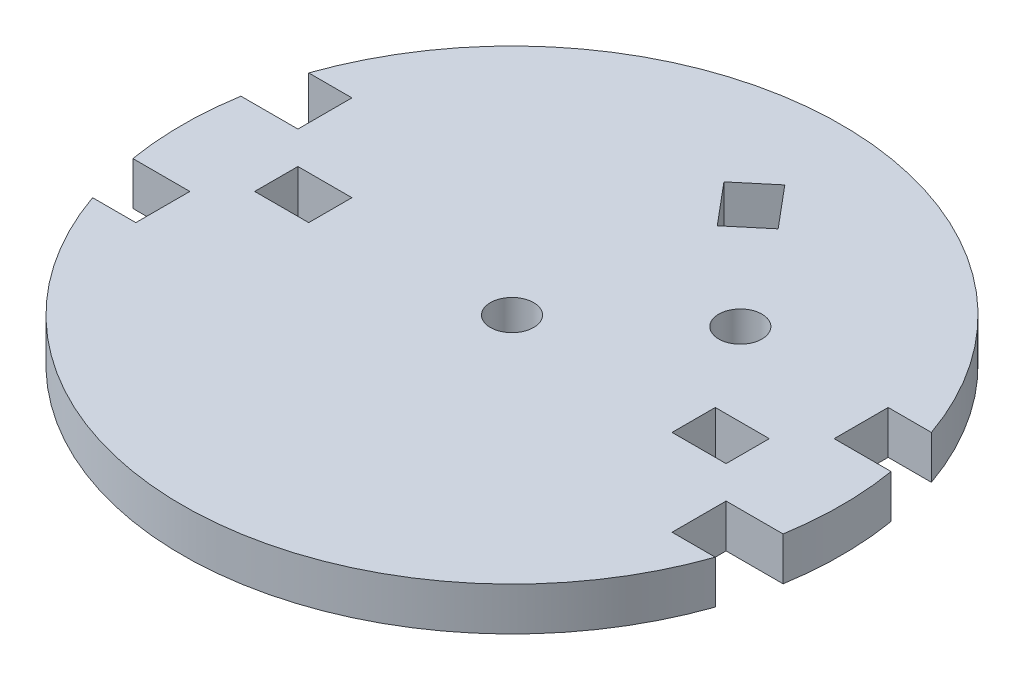
ISO-10303-21;
HEADER;
FILE_DESCRIPTION(('STEP AP214'),'2;1');
FILE_NAME('part.step','',(''),(''),'','','');
FILE_SCHEMA(('AUTOMOTIVE_DESIGN { 1 0 10303 214 1 1 1 1 }'));
ENDSEC;
DATA;
#1=APPLICATION_CONTEXT('core data for automotive mechanical design processes');
#2=APPLICATION_PROTOCOL_DEFINITION('international standard','automotive_design',2000,#1);
#3=PRODUCT_CONTEXT('',#1,'mechanical');
#4=PRODUCT('Part','Part','',(#3));
#5=PRODUCT_RELATED_PRODUCT_CATEGORY('part','',(#4));
#6=PRODUCT_DEFINITION_FORMATION('','',#4);
#7=PRODUCT_DEFINITION_CONTEXT('part definition',#1,'design');
#8=PRODUCT_DEFINITION('design','',#6,#7);
#9=PRODUCT_DEFINITION_SHAPE('','',#8);
#10=(LENGTH_UNIT() NAMED_UNIT(*) SI_UNIT(.MILLI.,.METRE.));
#11=(NAMED_UNIT(*) PLANE_ANGLE_UNIT() SI_UNIT($,.RADIAN.));
#12=(NAMED_UNIT(*) SI_UNIT($,.STERADIAN.) SOLID_ANGLE_UNIT());
#13=UNCERTAINTY_MEASURE_WITH_UNIT(LENGTH_MEASURE(1.E-05),#10,'distance_accuracy_value','');
#14=(GEOMETRIC_REPRESENTATION_CONTEXT(3) GLOBAL_UNCERTAINTY_ASSIGNED_CONTEXT((#13)) GLOBAL_UNIT_ASSIGNED_CONTEXT((#10,
#11,#12)) REPRESENTATION_CONTEXT('',''));
#15=CARTESIAN_POINT('',(0.,0.,0.));
#16=DIRECTION('',(0.,0.,1.));
#17=DIRECTION('',(1.,0.,0.));
#18=AXIS2_PLACEMENT_3D('',#15,#16,#17);
#19=CARTESIAN_POINT('',(0.,4.,0.));
#20=DIRECTION('',(0.,1.,0.));
#21=DIRECTION('',(0.,0.,1.));
#22=AXIS2_PLACEMENT_3D('',#19,#20,#21);
#23=PLANE('',#22);
#24=DIRECTION('',(0.,0.,1.));
#25=VECTOR('',#24,1.);
#26=CARTESIAN_POINT('',(24.8140590684478,4.,0.));
#27=LINE('',#26,#25);
#28=CARTESIAN_POINT('',(24.8140590684478,4.,5.));
#29=VERTEX_POINT('',#28);
#30=CARTESIAN_POINT('',(24.8140590684478,4.,10.));
#31=VERTEX_POINT('',#30);
#32=EDGE_CURVE('E319',#29,#31,#27,.T.);
#33=ORIENTED_EDGE('',*,*,#32,.F.);
#34=DIRECTION('',(1.,0.,0.));
#35=VECTOR('',#34,1.);
#36=CARTESIAN_POINT('',(0.,4.,5.));
#37=LINE('',#36,#35);
#38=CARTESIAN_POINT('',(30.0873727666608,4.,5.));
#39=VERTEX_POINT('',#38);
#40=EDGE_CURVE('E330',#29,#39,#37,.T.);
#41=ORIENTED_EDGE('',*,*,#40,.T.);
#42=CARTESIAN_POINT('',(0.,4.,0.));
#43=DIRECTION('',(0.,1.,0.));
#44=DIRECTION('',(0.,0.,1.));
#45=AXIS2_PLACEMENT_3D('',#42,#43,#44);
#46=CIRCLE('',#45,30.5);
#47=CARTESIAN_POINT('',(30.0873727666608,4.,-5.));
#48=VERTEX_POINT('',#47);
#49=EDGE_CURVE('E42',#39,#48,#46,.T.);
#50=ORIENTED_EDGE('',*,*,#49,.T.);
#51=DIRECTION('',(1.,0.,0.));
#52=VECTOR('',#51,1.);
#53=CARTESIAN_POINT('',(0.,4.,-5.00000000000001));
#54=LINE('',#53,#52);
#55=CARTESIAN_POINT('',(24.8140590684478,4.,-5.));
#56=VERTEX_POINT('',#55);
#57=EDGE_CURVE('E354',#56,#48,#54,.T.);
#58=ORIENTED_EDGE('',*,*,#57,.F.);
#59=DIRECTION('',(0.,0.,-1.));
#60=VECTOR('',#59,1.);
#61=CARTESIAN_POINT('',(24.8140590684478,4.,0.));
#62=LINE('',#61,#60);
#63=CARTESIAN_POINT('',(24.8140590684478,4.,-10.));
#64=VERTEX_POINT('',#63);
#65=EDGE_CURVE('E362',#56,#64,#62,.T.);
#66=ORIENTED_EDGE('',*,*,#65,.T.);
#67=DIRECTION('',(1.,0.,0.));
#68=VECTOR('',#67,1.);
#69=CARTESIAN_POINT('',(0.,4.,-10.));
#70=LINE('',#69,#68);
#71=CARTESIAN_POINT('',(28.8140590684478,4.,-10.));
#72=VERTEX_POINT('',#71);
#73=EDGE_CURVE('E344',#64,#72,#70,.T.);
#74=ORIENTED_EDGE('',*,*,#73,.T.);
#75=CARTESIAN_POINT('',(-28.8140590684478,4.,-10.));
#76=VERTEX_POINT('',#75);
#77=EDGE_CURVE('E587',#72,#76,#46,.T.);
#78=ORIENTED_EDGE('',*,*,#77,.T.);
#79=DIRECTION('',(-1.,0.,0.));
#80=VECTOR('',#79,1.);
#81=CARTESIAN_POINT('',(0.,4.,-10.));
#82=LINE('',#81,#80);
#83=CARTESIAN_POINT('',(-24.8140590684478,4.,-10.));
#84=VERTEX_POINT('',#83);
#85=EDGE_CURVE('E379',#84,#76,#82,.T.);
#86=ORIENTED_EDGE('',*,*,#85,.F.);
#87=DIRECTION('',(0.,0.,-1.));
#88=VECTOR('',#87,1.);
#89=CARTESIAN_POINT('',(-24.8140590684478,4.,0.));
#90=LINE('',#89,#88);
#91=CARTESIAN_POINT('',(-24.8140590684478,4.,-5.));
#92=VERTEX_POINT('',#91);
#93=EDGE_CURVE('E388',#92,#84,#90,.T.);
#94=ORIENTED_EDGE('',*,*,#93,.F.);
#95=DIRECTION('',(-1.,0.,0.));
#96=VECTOR('',#95,1.);
#97=CARTESIAN_POINT('',(0.,4.,-5.));
#98=LINE('',#97,#96);
#99=CARTESIAN_POINT('',(-30.0873727666608,4.,-5.));
#100=VERTEX_POINT('',#99);
#101=EDGE_CURVE('E369',#92,#100,#98,.T.);
#102=ORIENTED_EDGE('',*,*,#101,.T.);
#103=CARTESIAN_POINT('',(-30.0873727666608,4.,5.));
#104=VERTEX_POINT('',#103);
#105=EDGE_CURVE('E43',#100,#104,#46,.T.);
#106=ORIENTED_EDGE('',*,*,#105,.T.);
#107=DIRECTION('',(-1.,0.,0.));
#108=VECTOR('',#107,1.);
#109=CARTESIAN_POINT('',(0.,4.,5.00000000000001));
#110=LINE('',#109,#108);
#111=CARTESIAN_POINT('',(-24.8140590684478,4.,5.));
#112=VERTEX_POINT('',#111);
#113=EDGE_CURVE('E395',#112,#104,#110,.T.);
#114=ORIENTED_EDGE('',*,*,#113,.F.);
#115=DIRECTION('',(0.,0.,1.));
#116=VECTOR('',#115,1.);
#117=CARTESIAN_POINT('',(-24.8140590684478,4.,0.));
#118=LINE('',#117,#116);
#119=CARTESIAN_POINT('',(-24.8140590684478,4.,10.));
#120=VERTEX_POINT('',#119);
#121=EDGE_CURVE('E406',#112,#120,#118,.T.);
#122=ORIENTED_EDGE('',*,*,#121,.T.);
#123=DIRECTION('',(-1.,0.,0.));
#124=VECTOR('',#123,1.);
#125=CARTESIAN_POINT('',(0.,4.,10.));
#126=LINE('',#125,#124);
#127=CARTESIAN_POINT('',(-28.8140590684478,4.,10.));
#128=VERTEX_POINT('',#127);
#129=EDGE_CURVE('E414',#120,#128,#126,.T.);
#130=ORIENTED_EDGE('',*,*,#129,.T.);
#131=CARTESIAN_POINT('',(28.8140590684478,4.,10.));
#132=VERTEX_POINT('',#131);
#133=EDGE_CURVE('E11',#128,#132,#46,.T.);
#134=ORIENTED_EDGE('',*,*,#133,.T.);
#135=DIRECTION('',(1.,0.,0.));
#136=VECTOR('',#135,1.);
#137=CARTESIAN_POINT('',(0.,4.,10.));
#138=LINE('',#137,#136);
#139=EDGE_CURVE('E338',#31,#132,#138,.T.);
#140=ORIENTED_EDGE('',*,*,#139,.F.);
#141=EDGE_LOOP('',(#33,#41,#50,#58,#66,#74,#78,#86,#94,#102,#106,#114,#122,#130,#134,#140));
#142=FACE_BOUND('',#141,.T.);
#143=CARTESIAN_POINT('',(0.,4.,0.));
#144=DIRECTION('',(0.,1.,0.));
#145=DIRECTION('',(0.,0.,1.));
#146=AXIS2_PLACEMENT_3D('',#143,#144,#145);
#147=CIRCLE('',#146,2.);
#148=CARTESIAN_POINT('',(0.,4.,2.));
#149=VERTEX_POINT('',#148);
#150=EDGE_CURVE('E421',#149,#149,#147,.T.);
#151=ORIENTED_EDGE('',*,*,#150,.F.);
#152=EDGE_LOOP('',(#151));
#153=FACE_BOUND('',#152,.T.);
#154=DIRECTION('',(0.,0.,-1.));
#155=VECTOR('',#154,1.);
#156=CARTESIAN_POINT('',(-16.8140590684478,4.,2.));
#157=LINE('',#156,#155);
#158=CARTESIAN_POINT('',(-16.8140590684478,4.,2.));
#159=VERTEX_POINT('',#158);
#160=CARTESIAN_POINT('',(-16.8140590684478,4.,-2.));
#161=VERTEX_POINT('',#160);
#162=EDGE_CURVE('E287',#159,#161,#157,.T.);
#163=ORIENTED_EDGE('',*,*,#162,.F.);
#164=DIRECTION('',(1.,0.,0.));
#165=VECTOR('',#164,1.);
#166=CARTESIAN_POINT('',(-16.8140590684478,4.,2.));
#167=LINE('',#166,#165);
#168=CARTESIAN_POINT('',(-21.8140590684478,4.,2.));
#169=VERTEX_POINT('',#168);
#170=EDGE_CURVE('E298',#169,#159,#167,.T.);
#171=ORIENTED_EDGE('',*,*,#170,.F.);
#172=DIRECTION('',(0.,0.,1.));
#173=VECTOR('',#172,1.);
#174=CARTESIAN_POINT('',(-21.8140590684478,4.,-2.));
#175=LINE('',#174,#173);
#176=CARTESIAN_POINT('',(-21.8140590684478,4.,-2.));
#177=VERTEX_POINT('',#176);
#178=EDGE_CURVE('E312',#177,#169,#175,.T.);
#179=ORIENTED_EDGE('',*,*,#178,.F.);
#180=DIRECTION('',(-1.,0.,0.));
#181=VECTOR('',#180,1.);
#182=CARTESIAN_POINT('',(-16.8140590684478,4.,-2.));
#183=LINE('',#182,#181);
#184=EDGE_CURVE('E309',#161,#177,#183,.T.);
#185=ORIENTED_EDGE('',*,*,#184,.F.);
#186=EDGE_LOOP('',(#163,#171,#179,#185));
#187=FACE_BOUND('',#186,.T.);
#188=DIRECTION('',(0.,0.,1.));
#189=VECTOR('',#188,1.);
#190=CARTESIAN_POINT('',(16.8140590684478,4.,2.));
#191=LINE('',#190,#189);
#192=CARTESIAN_POINT('',(16.8140590684478,4.,-2.));
#193=VERTEX_POINT('',#192);
#194=CARTESIAN_POINT('',(16.8140590684478,4.,2.));
#195=VERTEX_POINT('',#194);
#196=EDGE_CURVE('E259',#193,#195,#191,.T.);
#197=ORIENTED_EDGE('',*,*,#196,.F.);
#198=DIRECTION('',(-1.,0.,0.));
#199=VECTOR('',#198,1.);
#200=CARTESIAN_POINT('',(16.8140590684478,4.,-2.));
#201=LINE('',#200,#199);
#202=CARTESIAN_POINT('',(21.8140590684478,4.,-2.));
#203=VERTEX_POINT('',#202);
#204=EDGE_CURVE('E266',#203,#193,#201,.T.);
#205=ORIENTED_EDGE('',*,*,#204,.F.);
#206=DIRECTION('',(0.,0.,-1.));
#207=VECTOR('',#206,1.);
#208=CARTESIAN_POINT('',(21.8140590684478,4.,-2.));
#209=LINE('',#208,#207);
#210=CARTESIAN_POINT('',(21.8140590684478,4.,2.));
#211=VERTEX_POINT('',#210);
#212=EDGE_CURVE('E280',#211,#203,#209,.T.);
#213=ORIENTED_EDGE('',*,*,#212,.F.);
#214=DIRECTION('',(1.,0.,0.));
#215=VECTOR('',#214,1.);
#216=CARTESIAN_POINT('',(16.8140590684478,4.,2.));
#217=LINE('',#216,#215);
#218=EDGE_CURVE('E277',#195,#211,#217,.T.);
#219=ORIENTED_EDGE('',*,*,#218,.F.);
#220=EDGE_LOOP('',(#197,#205,#213,#219));
#221=FACE_BOUND('',#220,.T.);
#222=CARTESIAN_POINT('',(11.4906666467847,4.,-9.64181414529814));
#223=DIRECTION('',(0.,1.,0.));
#224=DIRECTION('',(0.,0.,1.));
#225=AXIS2_PLACEMENT_3D('',#222,#223,#224);
#226=CIRCLE('',#225,2.);
#227=CARTESIAN_POINT('',(11.4906666467847,4.,-7.64181414529814));
#228=VERTEX_POINT('',#227);
#229=EDGE_CURVE('E252',#228,#228,#226,.T.);
#230=ORIENTED_EDGE('',*,*,#229,.F.);
#231=EDGE_LOOP('',(#230));
#232=FACE_BOUND('',#231,.T.);
#233=DIRECTION('',(0.642787609686539,0.,0.766044443118978));
#234=VECTOR('',#233,1.);
#235=CARTESIAN_POINT('',(12.6397333114632,4.,-10.6059955598279));
#236=LINE('',#235,#234);
#237=CARTESIAN_POINT('',(2.19443465405687,4.,-23.0542177605114));
#238=VERTEX_POINT('',#237);
#239=CARTESIAN_POINT('',(5.40837270248957,4.,-19.2239955449165));
#240=VERTEX_POINT('',#239);
#241=EDGE_CURVE('E246',#238,#240,#236,.T.);
#242=ORIENTED_EDGE('',*,*,#241,.T.);
#243=DIRECTION('',(-0.766044443118978,0.,0.64278760968654));
#244=VECTOR('',#243,1.);
#245=CARTESIAN_POINT('',(-7.23136060897363,4.,-8.61799998508857));
#246=LINE('',#245,#244);
#247=CARTESIAN_POINT('',(2.34419493001365,4.,-16.6528451061704));
#248=VERTEX_POINT('',#247);
#249=EDGE_CURVE('E50',#240,#248,#246,.T.);
#250=ORIENTED_EDGE('',*,*,#249,.T.);
#251=DIRECTION('',(0.64278760968654,0.,0.766044443118978));
#252=VECTOR('',#251,1.);
#253=CARTESIAN_POINT('',(9.57555553898728,4.,-8.03484512108179));
#254=LINE('',#253,#252);
#255=CARTESIAN_POINT('',(-0.869743118419053,4.,-20.4830673217653));
#256=VERTEX_POINT('',#255);
#257=EDGE_CURVE('E237',#256,#248,#254,.T.);
#258=ORIENTED_EDGE('',*,*,#257,.F.);
#259=DIRECTION('',(-0.766044443118979,0.,0.642787609686538));
#260=VECTOR('',#259,1.);
#261=CARTESIAN_POINT('',(-10.4452986574063,4.,-12.4482222006835));
#262=LINE('',#261,#260);
#263=EDGE_CURVE('E240',#238,#256,#262,.T.);
#264=ORIENTED_EDGE('',*,*,#263,.F.);
#265=EDGE_LOOP('',(#242,#250,#258,#264));
#266=FACE_BOUND('',#265,.T.);
#267=ADVANCED_FACE('F33',(#142,#153,#187,#221,#232,#266),#23,.T.);
#268=CARTESIAN_POINT('',(0.,0.,0.));
#269=DIRECTION('',(0.,1.,0.));
#270=DIRECTION('',(0.,0.,1.));
#271=AXIS2_PLACEMENT_3D('',#268,#269,#270);
#272=PLANE('',#271);
#273=DIRECTION('',(1.,0.,0.));
#274=VECTOR('',#273,1.);
#275=CARTESIAN_POINT('',(0.,0.,5.));
#276=LINE('',#275,#274);
#277=CARTESIAN_POINT('',(24.8140590684478,0.,5.));
#278=VERTEX_POINT('',#277);
#279=CARTESIAN_POINT('',(30.0873727666608,0.,5.));
#280=VERTEX_POINT('',#279);
#281=EDGE_CURVE('E333',#278,#280,#276,.T.);
#282=ORIENTED_EDGE('',*,*,#281,.F.);
#283=DIRECTION('',(0.,0.,1.));
#284=VECTOR('',#283,1.);
#285=CARTESIAN_POINT('',(24.8140590684478,0.,0.));
#286=LINE('',#285,#284);
#287=CARTESIAN_POINT('',(24.8140590684478,0.,10.));
#288=VERTEX_POINT('',#287);
#289=EDGE_CURVE('E326',#278,#288,#286,.T.);
#290=ORIENTED_EDGE('',*,*,#289,.T.);
#291=DIRECTION('',(1.,0.,0.));
#292=VECTOR('',#291,1.);
#293=CARTESIAN_POINT('',(0.,0.,10.));
#294=LINE('',#293,#292);
#295=CARTESIAN_POINT('',(28.8140590684478,0.,10.));
#296=VERTEX_POINT('',#295);
#297=EDGE_CURVE('E329',#288,#296,#294,.T.);
#298=ORIENTED_EDGE('',*,*,#297,.T.);
#299=CARTESIAN_POINT('',(0.,0.,0.));
#300=DIRECTION('',(0.,1.,0.));
#301=DIRECTION('',(0.,0.,1.));
#302=AXIS2_PLACEMENT_3D('',#299,#300,#301);
#303=CIRCLE('',#302,30.5);
#304=CARTESIAN_POINT('',(-28.8140590684478,0.,10.));
#305=VERTEX_POINT('',#304);
#306=EDGE_CURVE('E37',#305,#296,#303,.T.);
#307=ORIENTED_EDGE('',*,*,#306,.F.);
#308=DIRECTION('',(-1.,0.,0.));
#309=VECTOR('',#308,1.);
#310=CARTESIAN_POINT('',(0.,0.,10.));
#311=LINE('',#310,#309);
#312=CARTESIAN_POINT('',(-24.8140590684478,0.,10.));
#313=VERTEX_POINT('',#312);
#314=EDGE_CURVE('E405',#313,#305,#311,.T.);
#315=ORIENTED_EDGE('',*,*,#314,.F.);
#316=DIRECTION('',(0.,0.,1.));
#317=VECTOR('',#316,1.);
#318=CARTESIAN_POINT('',(-24.8140590684478,0.,0.));
#319=LINE('',#318,#317);
#320=CARTESIAN_POINT('',(-24.8140590684478,0.,5.));
#321=VERTEX_POINT('',#320);
#322=EDGE_CURVE('E408',#321,#313,#319,.T.);
#323=ORIENTED_EDGE('',*,*,#322,.F.);
#324=DIRECTION('',(-1.,0.,0.));
#325=VECTOR('',#324,1.);
#326=CARTESIAN_POINT('',(0.,0.,5.00000000000001));
#327=LINE('',#326,#325);
#328=CARTESIAN_POINT('',(-30.0873727666608,0.,5.));
#329=VERTEX_POINT('',#328);
#330=EDGE_CURVE('E402',#321,#329,#327,.T.);
#331=ORIENTED_EDGE('',*,*,#330,.T.);
#332=CARTESIAN_POINT('',(-30.0873727666608,0.,-5.));
#333=VERTEX_POINT('',#332);
#334=EDGE_CURVE('E431',#333,#329,#303,.T.);
#335=ORIENTED_EDGE('',*,*,#334,.F.);
#336=DIRECTION('',(-1.,0.,0.));
#337=VECTOR('',#336,1.);
#338=CARTESIAN_POINT('',(0.,0.,-5.));
#339=LINE('',#338,#337);
#340=CARTESIAN_POINT('',(-24.8140590684478,0.,-5.));
#341=VERTEX_POINT('',#340);
#342=EDGE_CURVE('E376',#341,#333,#339,.T.);
#343=ORIENTED_EDGE('',*,*,#342,.F.);
#344=DIRECTION('',(0.,0.,-1.));
#345=VECTOR('',#344,1.);
#346=CARTESIAN_POINT('',(-24.8140590684478,0.,0.));
#347=LINE('',#346,#345);
#348=CARTESIAN_POINT('',(-24.8140590684478,0.,-10.));
#349=VERTEX_POINT('',#348);
#350=EDGE_CURVE('E378',#341,#349,#347,.T.);
#351=ORIENTED_EDGE('',*,*,#350,.T.);
#352=DIRECTION('',(-1.,0.,0.));
#353=VECTOR('',#352,1.);
#354=CARTESIAN_POINT('',(0.,0.,-10.));
#355=LINE('',#354,#353);
#356=CARTESIAN_POINT('',(-28.8140590684478,0.,-10.));
#357=VERTEX_POINT('',#356);
#358=EDGE_CURVE('E382',#349,#357,#355,.T.);
#359=ORIENTED_EDGE('',*,*,#358,.T.);
#360=CARTESIAN_POINT('',(28.8140590684478,0.,-10.));
#361=VERTEX_POINT('',#360);
#362=EDGE_CURVE('E596',#361,#357,#303,.T.);
#363=ORIENTED_EDGE('',*,*,#362,.F.);
#364=DIRECTION('',(1.,0.,0.));
#365=VECTOR('',#364,1.);
#366=CARTESIAN_POINT('',(0.,0.,-10.));
#367=LINE('',#366,#365);
#368=CARTESIAN_POINT('',(24.8140590684478,0.,-10.));
#369=VERTEX_POINT('',#368);
#370=EDGE_CURVE('E351',#369,#361,#367,.T.);
#371=ORIENTED_EDGE('',*,*,#370,.F.);
#372=DIRECTION('',(0.,0.,-1.));
#373=VECTOR('',#372,1.);
#374=CARTESIAN_POINT('',(24.8140590684478,0.,0.));
#375=LINE('',#374,#373);
#376=CARTESIAN_POINT('',(24.8140590684478,0.,-5.));
#377=VERTEX_POINT('',#376);
#378=EDGE_CURVE('E353',#377,#369,#375,.T.);
#379=ORIENTED_EDGE('',*,*,#378,.F.);
#380=DIRECTION('',(1.,0.,0.));
#381=VECTOR('',#380,1.);
#382=CARTESIAN_POINT('',(0.,0.,-5.00000000000001));
#383=LINE('',#382,#381);
#384=CARTESIAN_POINT('',(30.0873727666608,0.,-5.));
#385=VERTEX_POINT('',#384);
#386=EDGE_CURVE('E356',#377,#385,#383,.T.);
#387=ORIENTED_EDGE('',*,*,#386,.T.);
#388=EDGE_CURVE('E581',#280,#385,#303,.T.);
#389=ORIENTED_EDGE('',*,*,#388,.F.);
#390=EDGE_LOOP('',(#282,#290,#298,#307,#315,#323,#331,#335,#343,#351,#359,#363,#371,#379,#387,#389));
#391=FACE_BOUND('',#390,.T.);
#392=CARTESIAN_POINT('',(0.,0.,0.));
#393=DIRECTION('',(0.,1.,0.));
#394=DIRECTION('',(0.,0.,1.));
#395=AXIS2_PLACEMENT_3D('',#392,#393,#394);
#396=CIRCLE('',#395,2.);
#397=CARTESIAN_POINT('',(0.,0.,2.));
#398=VERTEX_POINT('',#397);
#399=EDGE_CURVE('E428',#398,#398,#396,.T.);
#400=ORIENTED_EDGE('',*,*,#399,.T.);
#401=EDGE_LOOP('',(#400));
#402=FACE_BOUND('',#401,.T.);
#403=DIRECTION('',(1.,0.,0.));
#404=VECTOR('',#403,1.);
#405=CARTESIAN_POINT('',(-16.8140590684478,0.,2.));
#406=LINE('',#405,#404);
#407=CARTESIAN_POINT('',(-21.8140590684478,0.,2.));
#408=VERTEX_POINT('',#407);
#409=CARTESIAN_POINT('',(-16.8140590684478,0.,2.));
#410=VERTEX_POINT('',#409);
#411=EDGE_CURVE('E304',#408,#410,#406,.T.);
#412=ORIENTED_EDGE('',*,*,#411,.T.);
#413=DIRECTION('',(0.,0.,-1.));
#414=VECTOR('',#413,1.);
#415=CARTESIAN_POINT('',(-16.8140590684478,0.,2.));
#416=LINE('',#415,#414);
#417=CARTESIAN_POINT('',(-16.8140590684478,0.,-2.));
#418=VERTEX_POINT('',#417);
#419=EDGE_CURVE('E294',#410,#418,#416,.T.);
#420=ORIENTED_EDGE('',*,*,#419,.T.);
#421=DIRECTION('',(-1.,0.,0.));
#422=VECTOR('',#421,1.);
#423=CARTESIAN_POINT('',(-16.8140590684478,0.,-2.));
#424=LINE('',#423,#422);
#425=CARTESIAN_POINT('',(-21.8140590684478,0.,-2.));
#426=VERTEX_POINT('',#425);
#427=EDGE_CURVE('E297',#418,#426,#424,.T.);
#428=ORIENTED_EDGE('',*,*,#427,.T.);
#429=DIRECTION('',(0.,0.,1.));
#430=VECTOR('',#429,1.);
#431=CARTESIAN_POINT('',(-21.8140590684478,0.,-2.));
#432=LINE('',#431,#430);
#433=EDGE_CURVE('E301',#426,#408,#432,.T.);
#434=ORIENTED_EDGE('',*,*,#433,.T.);
#435=EDGE_LOOP('',(#412,#420,#428,#434));
#436=FACE_BOUND('',#435,.T.);
#437=DIRECTION('',(-1.,0.,0.));
#438=VECTOR('',#437,1.);
#439=CARTESIAN_POINT('',(16.8140590684478,0.,-2.));
#440=LINE('',#439,#438);
#441=CARTESIAN_POINT('',(21.8140590684478,0.,-2.));
#442=VERTEX_POINT('',#441);
#443=CARTESIAN_POINT('',(16.8140590684478,0.,-2.));
#444=VERTEX_POINT('',#443);
#445=EDGE_CURVE('E272',#442,#444,#440,.T.);
#446=ORIENTED_EDGE('',*,*,#445,.T.);
#447=DIRECTION('',(0.,0.,1.));
#448=VECTOR('',#447,1.);
#449=CARTESIAN_POINT('',(16.8140590684478,0.,2.));
#450=LINE('',#449,#448);
#451=CARTESIAN_POINT('',(16.8140590684478,0.,2.));
#452=VERTEX_POINT('',#451);
#453=EDGE_CURVE('E262',#444,#452,#450,.T.);
#454=ORIENTED_EDGE('',*,*,#453,.T.);
#455=DIRECTION('',(1.,0.,0.));
#456=VECTOR('',#455,1.);
#457=CARTESIAN_POINT('',(16.8140590684478,0.,2.));
#458=LINE('',#457,#456);
#459=CARTESIAN_POINT('',(21.8140590684478,0.,2.));
#460=VERTEX_POINT('',#459);
#461=EDGE_CURVE('E265',#452,#460,#458,.T.);
#462=ORIENTED_EDGE('',*,*,#461,.T.);
#463=DIRECTION('',(0.,0.,-1.));
#464=VECTOR('',#463,1.);
#465=CARTESIAN_POINT('',(21.8140590684478,0.,-2.));
#466=LINE('',#465,#464);
#467=EDGE_CURVE('E269',#460,#442,#466,.T.);
#468=ORIENTED_EDGE('',*,*,#467,.T.);
#469=EDGE_LOOP('',(#446,#454,#462,#468));
#470=FACE_BOUND('',#469,.T.);
#471=CARTESIAN_POINT('',(11.4906666467847,0.,-9.64181414529814));
#472=DIRECTION('',(0.,1.,0.));
#473=DIRECTION('',(0.,0.,1.));
#474=AXIS2_PLACEMENT_3D('',#471,#472,#473);
#475=CIRCLE('',#474,2.);
#476=CARTESIAN_POINT('',(11.4906666467847,0.,-7.64181414529814));
#477=VERTEX_POINT('',#476);
#478=EDGE_CURVE('E256',#477,#477,#475,.T.);
#479=ORIENTED_EDGE('',*,*,#478,.T.);
#480=EDGE_LOOP('',(#479));
#481=FACE_BOUND('',#480,.T.);
#482=DIRECTION('',(-0.766044443118978,0.,0.64278760968654));
#483=VECTOR('',#482,1.);
#484=CARTESIAN_POINT('',(-7.23136060897363,0.,-8.61799998508857));
#485=LINE('',#484,#483);
#486=CARTESIAN_POINT('',(5.40837270248956,0.,-19.2239955449165));
#487=VERTEX_POINT('',#486);
#488=CARTESIAN_POINT('',(2.34419493001365,0.,-16.6528451061704));
#489=VERTEX_POINT('',#488);
#490=EDGE_CURVE('E228',#487,#489,#485,.T.);
#491=ORIENTED_EDGE('',*,*,#490,.F.);
#492=DIRECTION('',(0.642787609686539,0.,0.766044443118978));
#493=VECTOR('',#492,1.);
#494=CARTESIAN_POINT('',(12.6397333114632,0.,-10.6059955598279));
#495=LINE('',#494,#493);
#496=CARTESIAN_POINT('',(2.19443465405687,0.,-23.0542177605114));
#497=VERTEX_POINT('',#496);
#498=EDGE_CURVE('E220',#497,#487,#495,.T.);
#499=ORIENTED_EDGE('',*,*,#498,.F.);
#500=DIRECTION('',(-0.766044443118979,0.,0.642787609686538));
#501=VECTOR('',#500,1.);
#502=CARTESIAN_POINT('',(-10.4452986574063,0.,-12.4482222006835));
#503=LINE('',#502,#501);
#504=CARTESIAN_POINT('',(-0.869743118419053,0.,-20.4830673217653));
#505=VERTEX_POINT('',#504);
#506=EDGE_CURVE('E58',#497,#505,#503,.T.);
#507=ORIENTED_EDGE('',*,*,#506,.T.);
#508=DIRECTION('',(0.64278760968654,0.,0.766044443118978));
#509=VECTOR('',#508,1.);
#510=CARTESIAN_POINT('',(9.57555553898728,0.,-8.03484512108179));
#511=LINE('',#510,#509);
#512=EDGE_CURVE('E232',#505,#489,#511,.T.);
#513=ORIENTED_EDGE('',*,*,#512,.T.);
#514=EDGE_LOOP('',(#491,#499,#507,#513));
#515=FACE_BOUND('',#514,.T.);
#516=ADVANCED_FACE('F235',(#391,#402,#436,#470,#481,#515),#272,.F.);
#517=CARTESIAN_POINT('',(0.,4.,0.));
#518=DIRECTION('',(0.,-1.,0.));
#519=DIRECTION('',(0.,0.,-1.));
#520=AXIS2_PLACEMENT_3D('',#517,#518,#519);
#521=CYLINDRICAL_SURFACE('',#520,30.5);
#522=DIRECTION('',(0.,1.,0.));
#523=VECTOR('',#522,1.);
#524=CARTESIAN_POINT('',(30.0873727666608,0.,5.));
#525=LINE('',#524,#523);
#526=EDGE_CURVE('E345',#280,#39,#525,.T.);
#527=ORIENTED_EDGE('',*,*,#526,.F.);
#528=ORIENTED_EDGE('',*,*,#388,.T.);
#529=DIRECTION('',(0.,1.,0.));
#530=VECTOR('',#529,1.);
#531=CARTESIAN_POINT('',(30.0873727666608,0.,-5.));
#532=LINE('',#531,#530);
#533=EDGE_CURVE('E370',#385,#48,#532,.T.);
#534=ORIENTED_EDGE('',*,*,#533,.T.);
#535=ORIENTED_EDGE('',*,*,#49,.F.);
#536=EDGE_LOOP('',(#527,#528,#534,#535));
#537=FACE_BOUND('',#536,.T.);
#538=ADVANCED_FACE('F554',(#537),#521,.T.);
#539=DIRECTION('',(0.,1.,0.));
#540=VECTOR('',#539,1.);
#541=CARTESIAN_POINT('',(28.8140590684478,0.,-10.));
#542=LINE('',#541,#540);
#543=EDGE_CURVE('E367',#361,#72,#542,.T.);
#544=ORIENTED_EDGE('',*,*,#543,.F.);
#545=ORIENTED_EDGE('',*,*,#362,.T.);
#546=DIRECTION('',(0.,1.,0.));
#547=VECTOR('',#546,1.);
#548=CARTESIAN_POINT('',(-28.8140590684478,0.,-10.));
#549=LINE('',#548,#547);
#550=EDGE_CURVE('E396',#357,#76,#549,.T.);
#551=ORIENTED_EDGE('',*,*,#550,.T.);
#552=ORIENTED_EDGE('',*,*,#77,.F.);
#553=EDGE_LOOP('',(#544,#545,#551,#552));
#554=FACE_BOUND('',#553,.T.);
#555=ADVANCED_FACE('F559',(#554),#521,.T.);
#556=DIRECTION('',(0.,1.,0.));
#557=VECTOR('',#556,1.);
#558=CARTESIAN_POINT('',(-30.0873727666608,0.,-5.));
#559=LINE('',#558,#557);
#560=EDGE_CURVE('E393',#333,#100,#559,.T.);
#561=ORIENTED_EDGE('',*,*,#560,.F.);
#562=ORIENTED_EDGE('',*,*,#334,.T.);
#563=DIRECTION('',(0.,1.,0.));
#564=VECTOR('',#563,1.);
#565=CARTESIAN_POINT('',(-30.0873727666608,0.,5.));
#566=LINE('',#565,#564);
#567=EDGE_CURVE('E411',#329,#104,#566,.T.);
#568=ORIENTED_EDGE('',*,*,#567,.T.);
#569=ORIENTED_EDGE('',*,*,#105,.F.);
#570=EDGE_LOOP('',(#561,#562,#568,#569));
#571=FACE_BOUND('',#570,.T.);
#572=ADVANCED_FACE('F620',(#571),#521,.T.);
#573=ORIENTED_EDGE('',*,*,#306,.T.);
#574=DIRECTION('',(0.,1.,0.));
#575=VECTOR('',#574,1.);
#576=CARTESIAN_POINT('',(28.8140590684478,0.,10.));
#577=LINE('',#576,#575);
#578=EDGE_CURVE('E347',#296,#132,#577,.T.);
#579=ORIENTED_EDGE('',*,*,#578,.T.);
#580=ORIENTED_EDGE('',*,*,#133,.F.);
#581=DIRECTION('',(0.,1.,0.));
#582=VECTOR('',#581,1.);
#583=CARTESIAN_POINT('',(-28.8140590684478,0.,10.));
#584=LINE('',#583,#582);
#585=EDGE_CURVE('E424',#305,#128,#584,.T.);
#586=ORIENTED_EDGE('',*,*,#585,.F.);
#587=EDGE_LOOP('',(#573,#579,#580,#586));
#588=FACE_BOUND('',#587,.T.);
#589=ADVANCED_FACE('F35',(#588),#521,.T.);
#590=CARTESIAN_POINT('',(0.,0.,0.));
#591=DIRECTION('',(0.,1.,0.));
#592=DIRECTION('',(0.,0.,1.));
#593=AXIS2_PLACEMENT_3D('',#590,#591,#592);
#594=CYLINDRICAL_SURFACE('',#593,2.);
#595=ORIENTED_EDGE('',*,*,#399,.F.);
#596=EDGE_LOOP('',(#595));
#597=FACE_BOUND('',#596,.T.);
#598=ORIENTED_EDGE('',*,*,#150,.T.);
#599=EDGE_LOOP('',(#598));
#600=FACE_BOUND('',#599,.T.);
#601=ADVANCED_FACE('F435',(#597,#600),#594,.F.);
#602=CARTESIAN_POINT('',(0.,0.,5.00000000000001));
#603=DIRECTION('',(0.,0.,-1.));
#604=DIRECTION('',(-1.,0.,0.));
#605=AXIS2_PLACEMENT_3D('',#602,#603,#604);
#606=PLANE('',#605);
#607=ORIENTED_EDGE('',*,*,#113,.T.);
#608=ORIENTED_EDGE('',*,*,#567,.F.);
#609=ORIENTED_EDGE('',*,*,#330,.F.);
#610=DIRECTION('',(0.,1.,0.));
#611=VECTOR('',#610,1.);
#612=CARTESIAN_POINT('',(-24.8140590684478,0.,5.));
#613=LINE('',#612,#611);
#614=EDGE_CURVE('E419',#321,#112,#613,.T.);
#615=ORIENTED_EDGE('',*,*,#614,.T.);
#616=EDGE_LOOP('',(#607,#608,#609,#615));
#617=FACE_BOUND('',#616,.T.);
#618=ADVANCED_FACE('F543',(#617),#606,.F.);
#619=CARTESIAN_POINT('',(-24.8140590684478,0.,0.));
#620=DIRECTION('',(-1.,0.,0.));
#621=DIRECTION('',(0.,0.,1.));
#622=AXIS2_PLACEMENT_3D('',#619,#620,#621);
#623=PLANE('',#622);
#624=ORIENTED_EDGE('',*,*,#121,.F.);
#625=ORIENTED_EDGE('',*,*,#614,.F.);
#626=ORIENTED_EDGE('',*,*,#322,.T.);
#627=DIRECTION('',(0.,1.,0.));
#628=VECTOR('',#627,1.);
#629=CARTESIAN_POINT('',(-24.8140590684478,0.,10.));
#630=LINE('',#629,#628);
#631=EDGE_CURVE('E422',#313,#120,#630,.T.);
#632=ORIENTED_EDGE('',*,*,#631,.T.);
#633=EDGE_LOOP('',(#624,#625,#626,#632));
#634=FACE_BOUND('',#633,.T.);
#635=ADVANCED_FACE('F540',(#634),#623,.T.);
#636=CARTESIAN_POINT('',(0.,0.,10.));
#637=DIRECTION('',(0.,0.,-1.));
#638=DIRECTION('',(-1.,0.,0.));
#639=AXIS2_PLACEMENT_3D('',#636,#637,#638);
#640=PLANE('',#639);
#641=ORIENTED_EDGE('',*,*,#129,.F.);
#642=ORIENTED_EDGE('',*,*,#631,.F.);
#643=ORIENTED_EDGE('',*,*,#314,.T.);
#644=ORIENTED_EDGE('',*,*,#585,.T.);
#645=EDGE_LOOP('',(#641,#642,#643,#644));
#646=FACE_BOUND('',#645,.T.);
#647=ADVANCED_FACE('F538',(#646),#640,.T.);
#648=CARTESIAN_POINT('',(0.,0.,-5.));
#649=DIRECTION('',(0.,0.,-1.));
#650=DIRECTION('',(-1.,0.,0.));
#651=AXIS2_PLACEMENT_3D('',#648,#649,#650);
#652=PLANE('',#651);
#653=ORIENTED_EDGE('',*,*,#101,.F.);
#654=DIRECTION('',(0.,1.,0.));
#655=VECTOR('',#654,1.);
#656=CARTESIAN_POINT('',(-24.8140590684478,0.,-5.));
#657=LINE('',#656,#655);
#658=EDGE_CURVE('E385',#341,#92,#657,.T.);
#659=ORIENTED_EDGE('',*,*,#658,.F.);
#660=ORIENTED_EDGE('',*,*,#342,.T.);
#661=ORIENTED_EDGE('',*,*,#560,.T.);
#662=EDGE_LOOP('',(#653,#659,#660,#661));
#663=FACE_BOUND('',#662,.T.);
#664=ADVANCED_FACE('F531',(#663),#652,.T.);
#665=CARTESIAN_POINT('',(0.,0.,-10.));
#666=DIRECTION('',(0.,0.,-1.));
#667=DIRECTION('',(-1.,0.,0.));
#668=AXIS2_PLACEMENT_3D('',#665,#666,#667);
#669=PLANE('',#668);
#670=ORIENTED_EDGE('',*,*,#85,.T.);
#671=ORIENTED_EDGE('',*,*,#550,.F.);
#672=ORIENTED_EDGE('',*,*,#358,.F.);
#673=DIRECTION('',(0.,1.,0.));
#674=VECTOR('',#673,1.);
#675=CARTESIAN_POINT('',(-24.8140590684478,0.,-10.));
#676=LINE('',#675,#674);
#677=EDGE_CURVE('E399',#349,#84,#676,.T.);
#678=ORIENTED_EDGE('',*,*,#677,.T.);
#679=EDGE_LOOP('',(#670,#671,#672,#678));
#680=FACE_BOUND('',#679,.T.);
#681=ADVANCED_FACE('F528',(#680),#669,.F.);
#682=CARTESIAN_POINT('',(-24.8140590684478,0.,0.));
#683=DIRECTION('',(1.,0.,0.));
#684=DIRECTION('',(0.,0.,-1.));
#685=AXIS2_PLACEMENT_3D('',#682,#683,#684);
#686=PLANE('',#685);
#687=ORIENTED_EDGE('',*,*,#93,.T.);
#688=ORIENTED_EDGE('',*,*,#677,.F.);
#689=ORIENTED_EDGE('',*,*,#350,.F.);
#690=ORIENTED_EDGE('',*,*,#658,.T.);
#691=EDGE_LOOP('',(#687,#688,#689,#690));
#692=FACE_BOUND('',#691,.T.);
#693=ADVANCED_FACE('F526',(#692),#686,.F.);
#694=CARTESIAN_POINT('',(0.,0.,-10.));
#695=DIRECTION('',(0.,0.,1.));
#696=DIRECTION('',(1.,0.,0.));
#697=AXIS2_PLACEMENT_3D('',#694,#695,#696);
#698=PLANE('',#697);
#699=ORIENTED_EDGE('',*,*,#73,.F.);
#700=DIRECTION('',(0.,1.,0.));
#701=VECTOR('',#700,1.);
#702=CARTESIAN_POINT('',(24.8140590684478,0.,-10.));
#703=LINE('',#702,#701);
#704=EDGE_CURVE('E359',#369,#64,#703,.T.);
#705=ORIENTED_EDGE('',*,*,#704,.F.);
#706=ORIENTED_EDGE('',*,*,#370,.T.);
#707=ORIENTED_EDGE('',*,*,#543,.T.);
#708=EDGE_LOOP('',(#699,#705,#706,#707));
#709=FACE_BOUND('',#708,.T.);
#710=ADVANCED_FACE('F519',(#709),#698,.T.);
#711=CARTESIAN_POINT('',(0.,0.,-5.00000000000001));
#712=DIRECTION('',(0.,0.,1.));
#713=DIRECTION('',(1.,0.,0.));
#714=AXIS2_PLACEMENT_3D('',#711,#712,#713);
#715=PLANE('',#714);
#716=ORIENTED_EDGE('',*,*,#57,.T.);
#717=ORIENTED_EDGE('',*,*,#533,.F.);
#718=ORIENTED_EDGE('',*,*,#386,.F.);
#719=DIRECTION('',(0.,1.,0.));
#720=VECTOR('',#719,1.);
#721=CARTESIAN_POINT('',(24.8140590684478,0.,-5.));
#722=LINE('',#721,#720);
#723=EDGE_CURVE('E373',#377,#56,#722,.T.);
#724=ORIENTED_EDGE('',*,*,#723,.T.);
#725=EDGE_LOOP('',(#716,#717,#718,#724));
#726=FACE_BOUND('',#725,.T.);
#727=ADVANCED_FACE('F516',(#726),#715,.F.);
#728=CARTESIAN_POINT('',(24.8140590684478,0.,0.));
#729=DIRECTION('',(1.,0.,0.));
#730=DIRECTION('',(0.,0.,-1.));
#731=AXIS2_PLACEMENT_3D('',#728,#729,#730);
#732=PLANE('',#731);
#733=ORIENTED_EDGE('',*,*,#65,.F.);
#734=ORIENTED_EDGE('',*,*,#723,.F.);
#735=ORIENTED_EDGE('',*,*,#378,.T.);
#736=ORIENTED_EDGE('',*,*,#704,.T.);
#737=EDGE_LOOP('',(#733,#734,#735,#736));
#738=FACE_BOUND('',#737,.T.);
#739=ADVANCED_FACE('F514',(#738),#732,.T.);
#740=CARTESIAN_POINT('',(24.8140590684478,0.,0.));
#741=DIRECTION('',(-1.,0.,0.));
#742=DIRECTION('',(0.,0.,1.));
#743=AXIS2_PLACEMENT_3D('',#740,#741,#742);
#744=PLANE('',#743);
#745=ORIENTED_EDGE('',*,*,#32,.T.);
#746=DIRECTION('',(0.,1.,0.));
#747=VECTOR('',#746,1.);
#748=CARTESIAN_POINT('',(24.8140590684478,0.,10.));
#749=LINE('',#748,#747);
#750=EDGE_CURVE('E335',#288,#31,#749,.T.);
#751=ORIENTED_EDGE('',*,*,#750,.F.);
#752=ORIENTED_EDGE('',*,*,#289,.F.);
#753=DIRECTION('',(0.,1.,0.));
#754=VECTOR('',#753,1.);
#755=CARTESIAN_POINT('',(24.8140590684478,0.,5.));
#756=LINE('',#755,#754);
#757=EDGE_CURVE('E342',#278,#29,#756,.T.);
#758=ORIENTED_EDGE('',*,*,#757,.T.);
#759=EDGE_LOOP('',(#745,#751,#752,#758));
#760=FACE_BOUND('',#759,.T.);
#761=ADVANCED_FACE('F507',(#760),#744,.F.);
#762=CARTESIAN_POINT('',(0.,0.,5.));
#763=DIRECTION('',(0.,0.,1.));
#764=DIRECTION('',(1.,0.,0.));
#765=AXIS2_PLACEMENT_3D('',#762,#763,#764);
#766=PLANE('',#765);
#767=ORIENTED_EDGE('',*,*,#40,.F.);
#768=ORIENTED_EDGE('',*,*,#757,.F.);
#769=ORIENTED_EDGE('',*,*,#281,.T.);
#770=ORIENTED_EDGE('',*,*,#526,.T.);
#771=EDGE_LOOP('',(#767,#768,#769,#770));
#772=FACE_BOUND('',#771,.T.);
#773=ADVANCED_FACE('F504',(#772),#766,.T.);
#774=CARTESIAN_POINT('',(0.,0.,10.));
#775=DIRECTION('',(0.,0.,1.));
#776=DIRECTION('',(1.,0.,0.));
#777=AXIS2_PLACEMENT_3D('',#774,#775,#776);
#778=PLANE('',#777);
#779=ORIENTED_EDGE('',*,*,#139,.T.);
#780=ORIENTED_EDGE('',*,*,#578,.F.);
#781=ORIENTED_EDGE('',*,*,#297,.F.);
#782=ORIENTED_EDGE('',*,*,#750,.T.);
#783=EDGE_LOOP('',(#779,#780,#781,#782));
#784=FACE_BOUND('',#783,.T.);
#785=ADVANCED_FACE('F502',(#784),#778,.F.);
#786=CARTESIAN_POINT('',(-16.8140590684478,0.,2.));
#787=DIRECTION('',(1.,0.,0.));
#788=DIRECTION('',(0.,0.,-1.));
#789=AXIS2_PLACEMENT_3D('',#786,#787,#788);
#790=PLANE('',#789);
#791=ORIENTED_EDGE('',*,*,#162,.T.);
#792=DIRECTION('',(0.,1.,0.));
#793=VECTOR('',#792,1.);
#794=CARTESIAN_POINT('',(-16.8140590684478,0.,-2.));
#795=LINE('',#794,#793);
#796=EDGE_CURVE('E307',#418,#161,#795,.T.);
#797=ORIENTED_EDGE('',*,*,#796,.F.);
#798=ORIENTED_EDGE('',*,*,#419,.F.);
#799=DIRECTION('',(0.,1.,0.));
#800=VECTOR('',#799,1.);
#801=CARTESIAN_POINT('',(-16.8140590684478,0.,2.));
#802=LINE('',#801,#800);
#803=EDGE_CURVE('E317',#410,#159,#802,.T.);
#804=ORIENTED_EDGE('',*,*,#803,.T.);
#805=EDGE_LOOP('',(#791,#797,#798,#804));
#806=FACE_BOUND('',#805,.T.);
#807=ADVANCED_FACE('F492',(#806),#790,.F.);
#808=CARTESIAN_POINT('',(-16.8140590684478,0.,2.));
#809=DIRECTION('',(0.,0.,1.));
#810=DIRECTION('',(1.,0.,0.));
#811=AXIS2_PLACEMENT_3D('',#808,#809,#810);
#812=PLANE('',#811);
#813=ORIENTED_EDGE('',*,*,#170,.T.);
#814=ORIENTED_EDGE('',*,*,#803,.F.);
#815=ORIENTED_EDGE('',*,*,#411,.F.);
#816=DIRECTION('',(0.,1.,0.));
#817=VECTOR('',#816,1.);
#818=CARTESIAN_POINT('',(-21.8140590684478,0.,2.));
#819=LINE('',#818,#817);
#820=EDGE_CURVE('E320',#408,#169,#819,.T.);
#821=ORIENTED_EDGE('',*,*,#820,.T.);
#822=EDGE_LOOP('',(#813,#814,#815,#821));
#823=FACE_BOUND('',#822,.T.);
#824=ADVANCED_FACE('F488',(#823),#812,.F.);
#825=CARTESIAN_POINT('',(-21.8140590684478,0.,-2.));
#826=DIRECTION('',(-1.,0.,0.));
#827=DIRECTION('',(0.,0.,1.));
#828=AXIS2_PLACEMENT_3D('',#825,#826,#827);
#829=PLANE('',#828);
#830=ORIENTED_EDGE('',*,*,#178,.T.);
#831=ORIENTED_EDGE('',*,*,#820,.F.);
#832=ORIENTED_EDGE('',*,*,#433,.F.);
#833=DIRECTION('',(0.,1.,0.));
#834=VECTOR('',#833,1.);
#835=CARTESIAN_POINT('',(-21.8140590684478,0.,-2.));
#836=LINE('',#835,#834);
#837=EDGE_CURVE('E322',#426,#177,#836,.T.);
#838=ORIENTED_EDGE('',*,*,#837,.T.);
#839=EDGE_LOOP('',(#830,#831,#832,#838));
#840=FACE_BOUND('',#839,.T.);
#841=ADVANCED_FACE('F491',(#840),#829,.F.);
#842=CARTESIAN_POINT('',(-16.8140590684478,0.,-2.));
#843=DIRECTION('',(0.,0.,-1.));
#844=DIRECTION('',(-1.,0.,0.));
#845=AXIS2_PLACEMENT_3D('',#842,#843,#844);
#846=PLANE('',#845);
#847=ORIENTED_EDGE('',*,*,#184,.T.);
#848=ORIENTED_EDGE('',*,*,#837,.F.);
#849=ORIENTED_EDGE('',*,*,#427,.F.);
#850=ORIENTED_EDGE('',*,*,#796,.T.);
#851=EDGE_LOOP('',(#847,#848,#849,#850));
#852=FACE_BOUND('',#851,.T.);
#853=ADVANCED_FACE('F486',(#852),#846,.F.);
#854=CARTESIAN_POINT('',(16.8140590684478,0.,2.));
#855=DIRECTION('',(-1.,0.,0.));
#856=DIRECTION('',(0.,0.,1.));
#857=AXIS2_PLACEMENT_3D('',#854,#855,#856);
#858=PLANE('',#857);
#859=ORIENTED_EDGE('',*,*,#196,.T.);
#860=DIRECTION('',(0.,1.,0.));
#861=VECTOR('',#860,1.);
#862=CARTESIAN_POINT('',(16.8140590684478,0.,2.));
#863=LINE('',#862,#861);
#864=EDGE_CURVE('E275',#452,#195,#863,.T.);
#865=ORIENTED_EDGE('',*,*,#864,.F.);
#866=ORIENTED_EDGE('',*,*,#453,.F.);
#867=DIRECTION('',(0.,1.,0.));
#868=VECTOR('',#867,1.);
#869=CARTESIAN_POINT('',(16.8140590684478,0.,-2.));
#870=LINE('',#869,#868);
#871=EDGE_CURVE('E285',#444,#193,#870,.T.);
#872=ORIENTED_EDGE('',*,*,#871,.T.);
#873=EDGE_LOOP('',(#859,#865,#866,#872));
#874=FACE_BOUND('',#873,.T.);
#875=ADVANCED_FACE('F476',(#874),#858,.F.);
#876=CARTESIAN_POINT('',(16.8140590684478,0.,-2.));
#877=DIRECTION('',(0.,0.,-1.));
#878=DIRECTION('',(-1.,0.,0.));
#879=AXIS2_PLACEMENT_3D('',#876,#877,#878);
#880=PLANE('',#879);
#881=ORIENTED_EDGE('',*,*,#204,.T.);
#882=ORIENTED_EDGE('',*,*,#871,.F.);
#883=ORIENTED_EDGE('',*,*,#445,.F.);
#884=DIRECTION('',(0.,1.,0.));
#885=VECTOR('',#884,1.);
#886=CARTESIAN_POINT('',(21.8140590684478,0.,-2.));
#887=LINE('',#886,#885);
#888=EDGE_CURVE('E288',#442,#203,#887,.T.);
#889=ORIENTED_EDGE('',*,*,#888,.T.);
#890=EDGE_LOOP('',(#881,#882,#883,#889));
#891=FACE_BOUND('',#890,.T.);
#892=ADVANCED_FACE('F472',(#891),#880,.F.);
#893=CARTESIAN_POINT('',(21.8140590684478,0.,-2.));
#894=DIRECTION('',(1.,0.,0.));
#895=DIRECTION('',(0.,0.,-1.));
#896=AXIS2_PLACEMENT_3D('',#893,#894,#895);
#897=PLANE('',#896);
#898=ORIENTED_EDGE('',*,*,#212,.T.);
#899=ORIENTED_EDGE('',*,*,#888,.F.);
#900=ORIENTED_EDGE('',*,*,#467,.F.);
#901=DIRECTION('',(0.,1.,0.));
#902=VECTOR('',#901,1.);
#903=CARTESIAN_POINT('',(21.8140590684478,0.,2.));
#904=LINE('',#903,#902);
#905=EDGE_CURVE('E290',#460,#211,#904,.T.);
#906=ORIENTED_EDGE('',*,*,#905,.T.);
#907=EDGE_LOOP('',(#898,#899,#900,#906));
#908=FACE_BOUND('',#907,.T.);
#909=ADVANCED_FACE('F475',(#908),#897,.F.);
#910=CARTESIAN_POINT('',(16.8140590684478,0.,2.));
#911=DIRECTION('',(0.,0.,1.));
#912=DIRECTION('',(1.,0.,0.));
#913=AXIS2_PLACEMENT_3D('',#910,#911,#912);
#914=PLANE('',#913);
#915=ORIENTED_EDGE('',*,*,#218,.T.);
#916=ORIENTED_EDGE('',*,*,#905,.F.);
#917=ORIENTED_EDGE('',*,*,#461,.F.);
#918=ORIENTED_EDGE('',*,*,#864,.T.);
#919=EDGE_LOOP('',(#915,#916,#917,#918));
#920=FACE_BOUND('',#919,.T.);
#921=ADVANCED_FACE('F470',(#920),#914,.F.);
#922=CARTESIAN_POINT('',(11.4906666467847,0.,-9.64181414529814));
#923=DIRECTION('',(0.,1.,0.));
#924=DIRECTION('',(0.,0.,1.));
#925=AXIS2_PLACEMENT_3D('',#922,#923,#924);
#926=CYLINDRICAL_SURFACE('',#925,2.);
#927=ORIENTED_EDGE('',*,*,#478,.F.);
#928=EDGE_LOOP('',(#927));
#929=FACE_BOUND('',#928,.T.);
#930=ORIENTED_EDGE('',*,*,#229,.T.);
#931=EDGE_LOOP('',(#930));
#932=FACE_BOUND('',#931,.T.);
#933=ADVANCED_FACE('F463',(#929,#932),#926,.F.);
#934=CARTESIAN_POINT('',(-7.23136060897363,0.,-8.61799998508857));
#935=DIRECTION('',(-0.64278760968654,0.,-0.766044443118978));
#936=DIRECTION('',(-0.766044443118978,0.,0.64278760968654));
#937=AXIS2_PLACEMENT_3D('',#934,#935,#936);
#938=PLANE('',#937);
#939=ORIENTED_EDGE('',*,*,#249,.F.);
#940=DIRECTION('',(0.,1.,0.));
#941=VECTOR('',#940,1.);
#942=CARTESIAN_POINT('',(5.40837270248956,0.,-19.2239955449165));
#943=LINE('',#942,#941);
#944=EDGE_CURVE('E223',#487,#240,#943,.T.);
#945=ORIENTED_EDGE('',*,*,#944,.F.);
#946=ORIENTED_EDGE('',*,*,#490,.T.);
#947=DIRECTION('',(0.,1.,0.));
#948=VECTOR('',#947,1.);
#949=CARTESIAN_POINT('',(2.34419493001365,0.,-16.6528451061704));
#950=LINE('',#949,#948);
#951=EDGE_CURVE('E250',#489,#248,#950,.T.);
#952=ORIENTED_EDGE('',*,*,#951,.T.);
#953=EDGE_LOOP('',(#939,#945,#946,#952));
#954=FACE_BOUND('',#953,.T.);
#955=ADVANCED_FACE('F230',(#954),#938,.T.);
#956=CARTESIAN_POINT('',(9.57555553898728,0.,-8.03484512108179));
#957=DIRECTION('',(-0.766044443118978,0.,0.64278760968654));
#958=DIRECTION('',(0.64278760968654,0.,0.766044443118978));
#959=AXIS2_PLACEMENT_3D('',#956,#957,#958);
#960=PLANE('',#959);
#961=ORIENTED_EDGE('',*,*,#257,.T.);
#962=ORIENTED_EDGE('',*,*,#951,.F.);
#963=ORIENTED_EDGE('',*,*,#512,.F.);
#964=DIRECTION('',(0.,1.,0.));
#965=VECTOR('',#964,1.);
#966=CARTESIAN_POINT('',(-0.869743118419053,0.,-20.4830673217653));
#967=LINE('',#966,#965);
#968=EDGE_CURVE('E253',#505,#256,#967,.T.);
#969=ORIENTED_EDGE('',*,*,#968,.T.);
#970=EDGE_LOOP('',(#961,#962,#963,#969));
#971=FACE_BOUND('',#970,.T.);
#972=ADVANCED_FACE('F455',(#971),#960,.F.);
#973=CARTESIAN_POINT('',(-10.4452986574063,0.,-12.4482222006835));
#974=DIRECTION('',(-0.642787609686538,0.,-0.766044443118979));
#975=DIRECTION('',(-0.766044443118979,0.,0.642787609686538));
#976=AXIS2_PLACEMENT_3D('',#973,#974,#975);
#977=PLANE('',#976);
#978=ORIENTED_EDGE('',*,*,#263,.T.);
#979=ORIENTED_EDGE('',*,*,#968,.F.);
#980=ORIENTED_EDGE('',*,*,#506,.F.);
#981=DIRECTION('',(0.,1.,0.));
#982=VECTOR('',#981,1.);
#983=CARTESIAN_POINT('',(2.19443465405687,0.,-23.0542177605114));
#984=LINE('',#983,#982);
#985=EDGE_CURVE('E225',#497,#238,#984,.T.);
#986=ORIENTED_EDGE('',*,*,#985,.T.);
#987=EDGE_LOOP('',(#978,#979,#980,#986));
#988=FACE_BOUND('',#987,.T.);
#989=ADVANCED_FACE('F453',(#988),#977,.F.);
#990=CARTESIAN_POINT('',(12.6397333114632,0.,-10.6059955598279));
#991=DIRECTION('',(-0.766044443118978,0.,0.642787609686539));
#992=DIRECTION('',(0.642787609686539,0.,0.766044443118978));
#993=AXIS2_PLACEMENT_3D('',#990,#991,#992);
#994=PLANE('',#993);
#995=ORIENTED_EDGE('',*,*,#241,.F.);
#996=ORIENTED_EDGE('',*,*,#985,.F.);
#997=ORIENTED_EDGE('',*,*,#498,.T.);
#998=ORIENTED_EDGE('',*,*,#944,.T.);
#999=EDGE_LOOP('',(#995,#996,#997,#998));
#1000=FACE_BOUND('',#999,.T.);
#1001=ADVANCED_FACE('F222',(#1000),#994,.T.);
#1002=CLOSED_SHELL('',(#267,#516,#538,#555,#572,#589,#601,#618,#635,#647,#664,#681,#693,#710,
#727,#739,#761,#773,#785,#807,#824,#841,#853,#875,#892,#909,#921,#933,#955,#972,#989,#1001));
#1003=MANIFOLD_SOLID_BREP('B2',#1002);
#1004=ADVANCED_BREP_SHAPE_REPRESENTATION('',(#18,#1003),#14);
#1005=SHAPE_DEFINITION_REPRESENTATION(#9,#1004);
ENDSEC;
END-ISO-10303-21;
